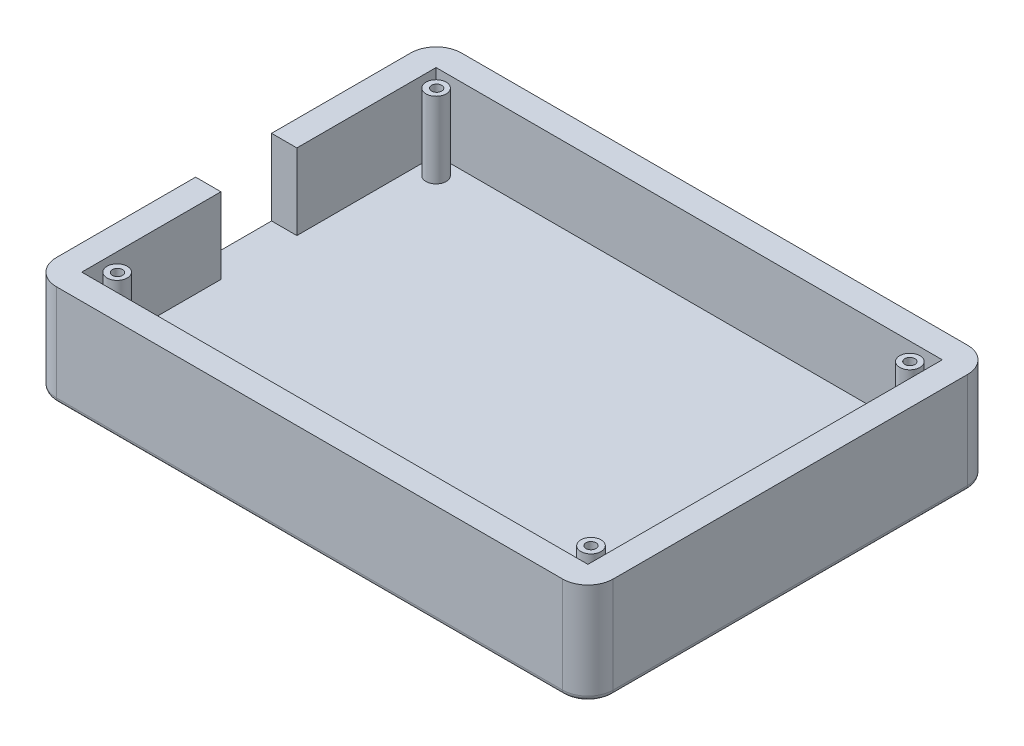
ISO-10303-21;
HEADER;
FILE_DESCRIPTION(('STEP AP214'),'2;1');
FILE_NAME('part.step','',(''),(''),'','','');
FILE_SCHEMA(('AUTOMOTIVE_DESIGN { 1 0 10303 214 1 1 1 1 }'));
ENDSEC;
DATA;
#1=APPLICATION_CONTEXT('core data for automotive mechanical design processes');
#2=APPLICATION_PROTOCOL_DEFINITION('international standard','automotive_design',2000,#1);
#3=PRODUCT_CONTEXT('',#1,'mechanical');
#4=PRODUCT('Part','Part','',(#3));
#5=PRODUCT_RELATED_PRODUCT_CATEGORY('part','',(#4));
#6=PRODUCT_DEFINITION_FORMATION('','',#4);
#7=PRODUCT_DEFINITION_CONTEXT('part definition',#1,'design');
#8=PRODUCT_DEFINITION('design','',#6,#7);
#9=PRODUCT_DEFINITION_SHAPE('','',#8);
#10=(LENGTH_UNIT() NAMED_UNIT(*) SI_UNIT(.MILLI.,.METRE.));
#11=(NAMED_UNIT(*) PLANE_ANGLE_UNIT() SI_UNIT($,.RADIAN.));
#12=(NAMED_UNIT(*) SI_UNIT($,.STERADIAN.) SOLID_ANGLE_UNIT());
#13=UNCERTAINTY_MEASURE_WITH_UNIT(LENGTH_MEASURE(1.E-05),#10,'distance_accuracy_value','');
#14=(GEOMETRIC_REPRESENTATION_CONTEXT(3) GLOBAL_UNCERTAINTY_ASSIGNED_CONTEXT((#13)) GLOBAL_UNIT_ASSIGNED_CONTEXT((#10,
#11,#12)) REPRESENTATION_CONTEXT('',''));
#15=CARTESIAN_POINT('',(0.,0.,0.));
#16=DIRECTION('',(0.,0.,1.));
#17=DIRECTION('',(1.,0.,0.));
#18=AXIS2_PLACEMENT_3D('',#15,#16,#17);
#19=CARTESIAN_POINT('',(-50.,20.,40.));
#20=DIRECTION('',(1.,0.,0.));
#21=DIRECTION('',(0.,0.,-1.));
#22=AXIS2_PLACEMENT_3D('',#19,#20,#21);
#23=PLANE('',#22);
#24=DIRECTION('',(0.,-1.,0.));
#25=VECTOR('',#24,1.);
#26=CARTESIAN_POINT('',(-50.,5.,-7.5));
#27=LINE('',#26,#25);
#28=CARTESIAN_POINT('',(-50.,20.,-7.5));
#29=VERTEX_POINT('',#28);
#30=CARTESIAN_POINT('',(-50.,5.,-7.5));
#31=VERTEX_POINT('',#30);
#32=EDGE_CURVE('E176',#29,#31,#27,.T.);
#33=ORIENTED_EDGE('',*,*,#32,.T.);
#34=DIRECTION('',(0.,0.,1.));
#35=VECTOR('',#34,1.);
#36=CARTESIAN_POINT('',(-50.,5.,0.));
#37=LINE('',#36,#35);
#38=CARTESIAN_POINT('',(-50.,5.,-35.));
#39=VERTEX_POINT('',#38);
#40=EDGE_CURVE('E455',#39,#31,#37,.T.);
#41=ORIENTED_EDGE('',*,*,#40,.F.);
#42=DIRECTION('',(0.,-1.,0.));
#43=VECTOR('',#42,1.);
#44=CARTESIAN_POINT('',(-50.,20.,-35.));
#45=LINE('',#44,#43);
#46=CARTESIAN_POINT('',(-50.,20.,-35.));
#47=VERTEX_POINT('',#46);
#48=EDGE_CURVE('E202',#47,#39,#45,.T.);
#49=ORIENTED_EDGE('',*,*,#48,.F.);
#50=DIRECTION('',(0.,0.,1.));
#51=VECTOR('',#50,1.);
#52=CARTESIAN_POINT('',(-50.,20.,0.));
#53=LINE('',#52,#51);
#54=EDGE_CURVE('E194',#47,#29,#53,.T.);
#55=ORIENTED_EDGE('',*,*,#54,.T.);
#56=EDGE_LOOP('',(#33,#41,#49,#55));
#57=FACE_BOUND('',#56,.T.);
#58=ADVANCED_FACE('F38',(#57),#23,.T.);
#59=CARTESIAN_POINT('',(0.,20.,0.));
#60=DIRECTION('',(0.,-1.,0.));
#61=DIRECTION('',(0.,0.,-1.));
#62=AXIS2_PLACEMENT_3D('',#59,#60,#61);
#63=PLANE('',#62);
#64=DIRECTION('',(0.,0.,1.));
#65=VECTOR('',#64,1.);
#66=CARTESIAN_POINT('',(-55.,20.,40.));
#67=LINE('',#66,#65);
#68=CARTESIAN_POINT('',(-55.,20.,-35.));
#69=VERTEX_POINT('',#68);
#70=CARTESIAN_POINT('',(-55.,20.,-7.5));
#71=VERTEX_POINT('',#70);
#72=EDGE_CURVE('E196',#69,#71,#67,.T.);
#73=ORIENTED_EDGE('',*,*,#72,.T.);
#74=DIRECTION('',(-1.,0.,0.));
#75=VECTOR('',#74,1.);
#76=CARTESIAN_POINT('',(-28.7867965644036,20.,-7.5));
#77=LINE('',#76,#75);
#78=EDGE_CURVE('E180',#29,#71,#77,.T.);
#79=ORIENTED_EDGE('',*,*,#78,.F.);
#80=ORIENTED_EDGE('',*,*,#54,.F.);
#81=DIRECTION('',(-1.,0.,0.));
#82=VECTOR('',#81,1.);
#83=CARTESIAN_POINT('',(0.,20.,-35.));
#84=LINE('',#83,#82);
#85=CARTESIAN_POINT('',(50.,20.,-35.));
#86=VERTEX_POINT('',#85);
#87=EDGE_CURVE('E211',#86,#47,#84,.T.);
#88=ORIENTED_EDGE('',*,*,#87,.F.);
#89=DIRECTION('',(0.,0.,-1.));
#90=VECTOR('',#89,1.);
#91=CARTESIAN_POINT('',(50.,20.,0.));
#92=LINE('',#91,#90);
#93=CARTESIAN_POINT('',(50.,20.,35.));
#94=VERTEX_POINT('',#93);
#95=EDGE_CURVE('E463',#94,#86,#92,.T.);
#96=ORIENTED_EDGE('',*,*,#95,.F.);
#97=DIRECTION('',(1.,0.,0.));
#98=VECTOR('',#97,1.);
#99=CARTESIAN_POINT('',(0.,20.,35.));
#100=LINE('',#99,#98);
#101=CARTESIAN_POINT('',(-50.,20.,35.));
#102=VERTEX_POINT('',#101);
#103=EDGE_CURVE('E204',#102,#94,#100,.T.);
#104=ORIENTED_EDGE('',*,*,#103,.F.);
#105=CARTESIAN_POINT('',(-50.,20.,7.5));
#106=VERTEX_POINT('',#105);
#107=EDGE_CURVE('E205',#106,#102,#53,.T.);
#108=ORIENTED_EDGE('',*,*,#107,.F.);
#109=DIRECTION('',(-1.,0.,0.));
#110=VECTOR('',#109,1.);
#111=CARTESIAN_POINT('',(-28.7867965644036,20.,7.5));
#112=LINE('',#111,#110);
#113=CARTESIAN_POINT('',(-55.,20.,7.5));
#114=VERTEX_POINT('',#113);
#115=EDGE_CURVE('E428',#106,#114,#112,.T.);
#116=ORIENTED_EDGE('',*,*,#115,.T.);
#117=CARTESIAN_POINT('',(-55.,20.,35.));
#118=VERTEX_POINT('',#117);
#119=EDGE_CURVE('E224',#114,#118,#67,.T.);
#120=ORIENTED_EDGE('',*,*,#119,.T.);
#121=CARTESIAN_POINT('',(-50.,20.,35.));
#122=DIRECTION('',(0.,-1.,0.));
#123=DIRECTION('',(0.,0.,-1.));
#124=AXIS2_PLACEMENT_3D('',#121,#122,#123);
#125=CIRCLE('',#124,5.);
#126=CARTESIAN_POINT('',(-50.,20.,40.));
#127=VERTEX_POINT('',#126);
#128=EDGE_CURVE('E244',#118,#127,#125,.F.);
#129=ORIENTED_EDGE('',*,*,#128,.T.);
#130=DIRECTION('',(1.,0.,0.));
#131=VECTOR('',#130,1.);
#132=CARTESIAN_POINT('',(-55.,20.,40.));
#133=LINE('',#132,#131);
#134=CARTESIAN_POINT('',(50.,20.,40.));
#135=VERTEX_POINT('',#134);
#136=EDGE_CURVE('E227',#127,#135,#133,.T.);
#137=ORIENTED_EDGE('',*,*,#136,.T.);
#138=CARTESIAN_POINT('',(50.,20.,35.));
#139=DIRECTION('',(0.,-1.,0.));
#140=DIRECTION('',(0.,0.,-1.));
#141=AXIS2_PLACEMENT_3D('',#138,#139,#140);
#142=CIRCLE('',#141,5.);
#143=CARTESIAN_POINT('',(55.,20.,35.));
#144=VERTEX_POINT('',#143);
#145=EDGE_CURVE('E247',#135,#144,#142,.F.);
#146=ORIENTED_EDGE('',*,*,#145,.T.);
#147=DIRECTION('',(0.,0.,-1.));
#148=VECTOR('',#147,1.);
#149=CARTESIAN_POINT('',(55.,20.,40.));
#150=LINE('',#149,#148);
#151=CARTESIAN_POINT('',(55.,20.,-35.));
#152=VERTEX_POINT('',#151);
#153=EDGE_CURVE('E215',#144,#152,#150,.T.);
#154=ORIENTED_EDGE('',*,*,#153,.T.);
#155=CARTESIAN_POINT('',(50.,20.,-35.));
#156=DIRECTION('',(0.,-1.,0.));
#157=DIRECTION('',(0.,0.,-1.));
#158=AXIS2_PLACEMENT_3D('',#155,#156,#157);
#159=CIRCLE('',#158,5.);
#160=CARTESIAN_POINT('',(50.,20.,-40.));
#161=VERTEX_POINT('',#160);
#162=EDGE_CURVE('E250',#152,#161,#159,.F.);
#163=ORIENTED_EDGE('',*,*,#162,.T.);
#164=DIRECTION('',(-1.,0.,0.));
#165=VECTOR('',#164,1.);
#166=CARTESIAN_POINT('',(-55.,20.,-40.));
#167=LINE('',#166,#165);
#168=CARTESIAN_POINT('',(-50.,20.,-40.));
#169=VERTEX_POINT('',#168);
#170=EDGE_CURVE('E219',#161,#169,#167,.T.);
#171=ORIENTED_EDGE('',*,*,#170,.T.);
#172=CARTESIAN_POINT('',(-50.,20.,-35.));
#173=DIRECTION('',(0.,-1.,0.));
#174=DIRECTION('',(0.,0.,-1.));
#175=AXIS2_PLACEMENT_3D('',#172,#173,#174);
#176=CIRCLE('',#175,5.);
#177=EDGE_CURVE('E253',#169,#69,#176,.F.);
#178=ORIENTED_EDGE('',*,*,#177,.T.);
#179=EDGE_LOOP('',(#73,#79,#80,#88,#96,#104,#108,#116,#120,#129,#137,#146,#154,#163,#171,#178));
#180=FACE_BOUND('',#179,.T.);
#181=ADVANCED_FACE('F192',(#180),#63,.F.);
#182=CARTESIAN_POINT('',(55.,20.,40.));
#183=DIRECTION('',(-1.,0.,0.));
#184=DIRECTION('',(0.,0.,1.));
#185=AXIS2_PLACEMENT_3D('',#182,#183,#184);
#186=PLANE('',#185);
#187=DIRECTION('',(0.,-1.,0.));
#188=VECTOR('',#187,1.);
#189=CARTESIAN_POINT('',(55.,20.,35.));
#190=LINE('',#189,#188);
#191=CARTESIAN_POINT('',(55.,1.,35.));
#192=VERTEX_POINT('',#191);
#193=EDGE_CURVE('E256',#144,#192,#190,.T.);
#194=ORIENTED_EDGE('',*,*,#193,.T.);
#195=DIRECTION('',(0.,0.,-1.));
#196=VECTOR('',#195,1.);
#197=CARTESIAN_POINT('',(55.,1.,-35.));
#198=LINE('',#197,#196);
#199=CARTESIAN_POINT('',(55.,1.,-35.));
#200=VERTEX_POINT('',#199);
#201=EDGE_CURVE('E11',#192,#200,#198,.T.);
#202=ORIENTED_EDGE('',*,*,#201,.T.);
#203=DIRECTION('',(0.,-1.,0.));
#204=VECTOR('',#203,1.);
#205=CARTESIAN_POINT('',(55.,20.,-35.));
#206=LINE('',#205,#204);
#207=EDGE_CURVE('E259',#200,#152,#206,.F.);
#208=ORIENTED_EDGE('',*,*,#207,.T.);
#209=ORIENTED_EDGE('',*,*,#153,.F.);
#210=EDGE_LOOP('',(#194,#202,#208,#209));
#211=FACE_BOUND('',#210,.T.);
#212=ADVANCED_FACE('F563',(#211),#186,.F.);
#213=CARTESIAN_POINT('',(-55.,20.,-40.));
#214=DIRECTION('',(0.,0.,1.));
#215=DIRECTION('',(1.,0.,0.));
#216=AXIS2_PLACEMENT_3D('',#213,#214,#215);
#217=PLANE('',#216);
#218=DIRECTION('',(0.,-1.,0.));
#219=VECTOR('',#218,1.);
#220=CARTESIAN_POINT('',(50.,20.,-40.));
#221=LINE('',#220,#219);
#222=CARTESIAN_POINT('',(50.,1.,-40.));
#223=VERTEX_POINT('',#222);
#224=EDGE_CURVE('E238',#161,#223,#221,.T.);
#225=ORIENTED_EDGE('',*,*,#224,.T.);
#226=DIRECTION('',(-1.,0.,0.));
#227=VECTOR('',#226,1.);
#228=CARTESIAN_POINT('',(-50.,1.,-40.));
#229=LINE('',#228,#227);
#230=CARTESIAN_POINT('',(-50.,1.,-40.));
#231=VERTEX_POINT('',#230);
#232=EDGE_CURVE('E326',#223,#231,#229,.T.);
#233=ORIENTED_EDGE('',*,*,#232,.T.);
#234=DIRECTION('',(0.,-1.,0.));
#235=VECTOR('',#234,1.);
#236=CARTESIAN_POINT('',(-50.,20.,-40.));
#237=LINE('',#236,#235);
#238=EDGE_CURVE('E241',#231,#169,#237,.F.);
#239=ORIENTED_EDGE('',*,*,#238,.T.);
#240=ORIENTED_EDGE('',*,*,#170,.F.);
#241=EDGE_LOOP('',(#225,#233,#239,#240));
#242=FACE_BOUND('',#241,.T.);
#243=ADVANCED_FACE('F537',(#242),#217,.F.);
#244=CARTESIAN_POINT('',(-55.,20.,40.));
#245=DIRECTION('',(1.,0.,0.));
#246=DIRECTION('',(0.,0.,-1.));
#247=AXIS2_PLACEMENT_3D('',#244,#245,#246);
#248=PLANE('',#247);
#249=DIRECTION('',(0.,-1.,0.));
#250=VECTOR('',#249,1.);
#251=CARTESIAN_POINT('',(-55.,20.,-35.));
#252=LINE('',#251,#250);
#253=CARTESIAN_POINT('',(-55.,1.,-35.));
#254=VERTEX_POINT('',#253);
#255=EDGE_CURVE('E234',#69,#254,#252,.T.);
#256=ORIENTED_EDGE('',*,*,#255,.T.);
#257=DIRECTION('',(0.,0.,1.));
#258=VECTOR('',#257,1.);
#259=CARTESIAN_POINT('',(-55.,1.,35.));
#260=LINE('',#259,#258);
#261=CARTESIAN_POINT('',(-55.,1.,35.));
#262=VERTEX_POINT('',#261);
#263=EDGE_CURVE('E320',#254,#262,#260,.T.);
#264=ORIENTED_EDGE('',*,*,#263,.T.);
#265=DIRECTION('',(0.,-1.,0.));
#266=VECTOR('',#265,1.);
#267=CARTESIAN_POINT('',(-55.,20.,35.));
#268=LINE('',#267,#266);
#269=EDGE_CURVE('E231',#262,#118,#268,.F.);
#270=ORIENTED_EDGE('',*,*,#269,.T.);
#271=ORIENTED_EDGE('',*,*,#119,.F.);
#272=DIRECTION('',(0.,1.,0.));
#273=VECTOR('',#272,1.);
#274=CARTESIAN_POINT('',(-55.,5.,7.5));
#275=LINE('',#274,#273);
#276=CARTESIAN_POINT('',(-55.,5.,7.5));
#277=VERTEX_POINT('',#276);
#278=EDGE_CURVE('E416',#277,#114,#275,.T.);
#279=ORIENTED_EDGE('',*,*,#278,.F.);
#280=DIRECTION('',(0.,0.,1.));
#281=VECTOR('',#280,1.);
#282=CARTESIAN_POINT('',(-55.,5.,-7.5));
#283=LINE('',#282,#281);
#284=CARTESIAN_POINT('',(-55.,5.,-7.5));
#285=VERTEX_POINT('',#284);
#286=EDGE_CURVE('E198',#285,#277,#283,.T.);
#287=ORIENTED_EDGE('',*,*,#286,.F.);
#288=DIRECTION('',(0.,-1.,0.));
#289=VECTOR('',#288,1.);
#290=CARTESIAN_POINT('',(-55.,5.,-7.5));
#291=LINE('',#290,#289);
#292=EDGE_CURVE('E420',#71,#285,#291,.T.);
#293=ORIENTED_EDGE('',*,*,#292,.F.);
#294=ORIENTED_EDGE('',*,*,#72,.F.);
#295=EDGE_LOOP('',(#256,#264,#270,#271,#279,#287,#293,#294));
#296=FACE_BOUND('',#295,.T.);
#297=ADVANCED_FACE('F494',(#296),#248,.F.);
#298=CARTESIAN_POINT('',(-55.,20.,40.));
#299=DIRECTION('',(0.,0.,-1.));
#300=DIRECTION('',(-1.,0.,0.));
#301=AXIS2_PLACEMENT_3D('',#298,#299,#300);
#302=PLANE('',#301);
#303=DIRECTION('',(0.,-1.,0.));
#304=VECTOR('',#303,1.);
#305=CARTESIAN_POINT('',(-50.,20.,40.));
#306=LINE('',#305,#304);
#307=CARTESIAN_POINT('',(-50.,1.,40.));
#308=VERTEX_POINT('',#307);
#309=EDGE_CURVE('E262',#127,#308,#306,.T.);
#310=ORIENTED_EDGE('',*,*,#309,.T.);
#311=DIRECTION('',(1.,0.,0.));
#312=VECTOR('',#311,1.);
#313=CARTESIAN_POINT('',(50.,1.,40.));
#314=LINE('',#313,#312);
#315=CARTESIAN_POINT('',(50.,1.,40.));
#316=VERTEX_POINT('',#315);
#317=EDGE_CURVE('E314',#308,#316,#314,.T.);
#318=ORIENTED_EDGE('',*,*,#317,.T.);
#319=DIRECTION('',(0.,-1.,0.));
#320=VECTOR('',#319,1.);
#321=CARTESIAN_POINT('',(50.,20.,40.));
#322=LINE('',#321,#320);
#323=EDGE_CURVE('E266',#316,#135,#322,.F.);
#324=ORIENTED_EDGE('',*,*,#323,.T.);
#325=ORIENTED_EDGE('',*,*,#136,.F.);
#326=EDGE_LOOP('',(#310,#318,#324,#325));
#327=FACE_BOUND('',#326,.T.);
#328=ADVANCED_FACE('F515',(#327),#302,.F.);
#329=CARTESIAN_POINT('',(0.,0.,0.));
#330=DIRECTION('',(0.,-1.,0.));
#331=DIRECTION('',(0.,0.,-1.));
#332=AXIS2_PLACEMENT_3D('',#329,#330,#331);
#333=PLANE('',#332);
#334=DIRECTION('',(0.,0.,-1.));
#335=VECTOR('',#334,1.);
#336=CARTESIAN_POINT('',(54.,0.,35.));
#337=LINE('',#336,#335);
#338=CARTESIAN_POINT('',(54.,0.,-35.));
#339=VERTEX_POINT('',#338);
#340=CARTESIAN_POINT('',(54.,0.,35.));
#341=VERTEX_POINT('',#340);
#342=EDGE_CURVE('E285',#339,#341,#337,.F.);
#343=ORIENTED_EDGE('',*,*,#342,.T.);
#344=CARTESIAN_POINT('',(50.,0.,35.));
#345=DIRECTION('',(0.,-1.,0.));
#346=DIRECTION('',(0.,0.,-1.));
#347=AXIS2_PLACEMENT_3D('',#344,#345,#346);
#348=CIRCLE('',#347,4.);
#349=CARTESIAN_POINT('',(50.,0.,39.));
#350=VERTEX_POINT('',#349);
#351=EDGE_CURVE('E306',#341,#350,#348,.T.);
#352=ORIENTED_EDGE('',*,*,#351,.T.);
#353=DIRECTION('',(1.,0.,0.));
#354=VECTOR('',#353,1.);
#355=CARTESIAN_POINT('',(-50.,0.,39.));
#356=LINE('',#355,#354);
#357=CARTESIAN_POINT('',(-50.,0.,39.));
#358=VERTEX_POINT('',#357);
#359=EDGE_CURVE('E303',#350,#358,#356,.F.);
#360=ORIENTED_EDGE('',*,*,#359,.T.);
#361=CARTESIAN_POINT('',(-50.,0.,35.));
#362=DIRECTION('',(0.,-1.,0.));
#363=DIRECTION('',(0.,0.,-1.));
#364=AXIS2_PLACEMENT_3D('',#361,#362,#363);
#365=CIRCLE('',#364,4.);
#366=CARTESIAN_POINT('',(-54.,0.,35.));
#367=VERTEX_POINT('',#366);
#368=EDGE_CURVE('E300',#358,#367,#365,.T.);
#369=ORIENTED_EDGE('',*,*,#368,.T.);
#370=DIRECTION('',(0.,0.,1.));
#371=VECTOR('',#370,1.);
#372=CARTESIAN_POINT('',(-54.,0.,-35.));
#373=LINE('',#372,#371);
#374=CARTESIAN_POINT('',(-54.,0.,-35.));
#375=VERTEX_POINT('',#374);
#376=EDGE_CURVE('E297',#367,#375,#373,.F.);
#377=ORIENTED_EDGE('',*,*,#376,.T.);
#378=CARTESIAN_POINT('',(-50.,0.,-35.));
#379=DIRECTION('',(0.,-1.,0.));
#380=DIRECTION('',(0.,0.,-1.));
#381=AXIS2_PLACEMENT_3D('',#378,#379,#380);
#382=CIRCLE('',#381,4.);
#383=CARTESIAN_POINT('',(-50.,0.,-39.));
#384=VERTEX_POINT('',#383);
#385=EDGE_CURVE('E294',#375,#384,#382,.T.);
#386=ORIENTED_EDGE('',*,*,#385,.T.);
#387=DIRECTION('',(-1.,0.,0.));
#388=VECTOR('',#387,1.);
#389=CARTESIAN_POINT('',(50.,0.,-39.));
#390=LINE('',#389,#388);
#391=CARTESIAN_POINT('',(50.,0.,-39.));
#392=VERTEX_POINT('',#391);
#393=EDGE_CURVE('E291',#384,#392,#390,.F.);
#394=ORIENTED_EDGE('',*,*,#393,.T.);
#395=CARTESIAN_POINT('',(50.,0.,-35.));
#396=DIRECTION('',(0.,-1.,0.));
#397=DIRECTION('',(0.,0.,-1.));
#398=AXIS2_PLACEMENT_3D('',#395,#396,#397);
#399=CIRCLE('',#398,4.);
#400=EDGE_CURVE('E288',#392,#339,#399,.T.);
#401=ORIENTED_EDGE('',*,*,#400,.T.);
#402=EDGE_LOOP('',(#343,#352,#360,#369,#377,#386,#394,#401));
#403=FACE_BOUND('',#402,.T.);
#404=ADVANCED_FACE('F547',(#403),#333,.T.);
#405=CARTESIAN_POINT('',(50.,20.,40.));
#406=DIRECTION('',(-1.,0.,0.));
#407=DIRECTION('',(0.,0.,1.));
#408=AXIS2_PLACEMENT_3D('',#405,#406,#407);
#409=PLANE('',#408);
#410=DIRECTION('',(0.,0.,-1.));
#411=VECTOR('',#410,1.);
#412=CARTESIAN_POINT('',(50.,5.,0.));
#413=LINE('',#412,#411);
#414=CARTESIAN_POINT('',(50.,5.,35.));
#415=VERTEX_POINT('',#414);
#416=CARTESIAN_POINT('',(50.,5.,-35.));
#417=VERTEX_POINT('',#416);
#418=EDGE_CURVE('E438',#415,#417,#413,.T.);
#419=ORIENTED_EDGE('',*,*,#418,.F.);
#420=DIRECTION('',(0.,-1.,0.));
#421=VECTOR('',#420,1.);
#422=CARTESIAN_POINT('',(50.,20.,35.));
#423=LINE('',#422,#421);
#424=EDGE_CURVE('E209',#94,#415,#423,.T.);
#425=ORIENTED_EDGE('',*,*,#424,.F.);
#426=ORIENTED_EDGE('',*,*,#95,.T.);
#427=DIRECTION('',(0.,-1.,0.));
#428=VECTOR('',#427,1.);
#429=CARTESIAN_POINT('',(50.,20.,-35.));
#430=LINE('',#429,#428);
#431=EDGE_CURVE('E220',#86,#417,#430,.T.);
#432=ORIENTED_EDGE('',*,*,#431,.T.);
#433=EDGE_LOOP('',(#419,#425,#426,#432));
#434=FACE_BOUND('',#433,.T.);
#435=ADVANCED_FACE('F479',(#434),#409,.T.);
#436=CARTESIAN_POINT('',(-55.,20.,-35.));
#437=DIRECTION('',(0.,0.,1.));
#438=DIRECTION('',(1.,0.,0.));
#439=AXIS2_PLACEMENT_3D('',#436,#437,#438);
#440=PLANE('',#439);
#441=DIRECTION('',(-1.,0.,0.));
#442=VECTOR('',#441,1.);
#443=CARTESIAN_POINT('',(0.,5.,-35.));
#444=LINE('',#443,#442);
#445=EDGE_CURVE('E442',#417,#39,#444,.T.);
#446=ORIENTED_EDGE('',*,*,#445,.F.);
#447=ORIENTED_EDGE('',*,*,#431,.F.);
#448=ORIENTED_EDGE('',*,*,#87,.T.);
#449=ORIENTED_EDGE('',*,*,#48,.T.);
#450=EDGE_LOOP('',(#446,#447,#448,#449));
#451=FACE_BOUND('',#450,.T.);
#452=ADVANCED_FACE('F471',(#451),#440,.T.);
#453=DIRECTION('',(0.,1.,0.));
#454=VECTOR('',#453,1.);
#455=CARTESIAN_POINT('',(-50.,5.,7.5));
#456=LINE('',#455,#454);
#457=CARTESIAN_POINT('',(-50.,5.,7.5));
#458=VERTEX_POINT('',#457);
#459=EDGE_CURVE('E425',#458,#106,#456,.T.);
#460=ORIENTED_EDGE('',*,*,#459,.T.);
#461=ORIENTED_EDGE('',*,*,#107,.T.);
#462=DIRECTION('',(0.,-1.,0.));
#463=VECTOR('',#462,1.);
#464=CARTESIAN_POINT('',(-50.,20.,35.));
#465=LINE('',#464,#463);
#466=CARTESIAN_POINT('',(-50.,5.,35.));
#467=VERTEX_POINT('',#466);
#468=EDGE_CURVE('E449',#102,#467,#465,.T.);
#469=ORIENTED_EDGE('',*,*,#468,.T.);
#470=EDGE_CURVE('E452',#458,#467,#37,.T.);
#471=ORIENTED_EDGE('',*,*,#470,.F.);
#472=EDGE_LOOP('',(#460,#461,#469,#471));
#473=FACE_BOUND('',#472,.T.);
#474=ADVANCED_FACE('F486',(#473),#23,.T.);
#475=CARTESIAN_POINT('',(-55.,20.,35.));
#476=DIRECTION('',(0.,0.,-1.));
#477=DIRECTION('',(-1.,0.,0.));
#478=AXIS2_PLACEMENT_3D('',#475,#476,#477);
#479=PLANE('',#478);
#480=DIRECTION('',(1.,0.,0.));
#481=VECTOR('',#480,1.);
#482=CARTESIAN_POINT('',(0.,5.,35.));
#483=LINE('',#482,#481);
#484=EDGE_CURVE('E458',#467,#415,#483,.T.);
#485=ORIENTED_EDGE('',*,*,#484,.F.);
#486=ORIENTED_EDGE('',*,*,#468,.F.);
#487=ORIENTED_EDGE('',*,*,#103,.T.);
#488=ORIENTED_EDGE('',*,*,#424,.T.);
#489=EDGE_LOOP('',(#485,#486,#487,#488));
#490=FACE_BOUND('',#489,.T.);
#491=ADVANCED_FACE('F477',(#490),#479,.T.);
#492=CARTESIAN_POINT('',(0.,5.,0.));
#493=DIRECTION('',(0.,-1.,0.));
#494=DIRECTION('',(0.,0.,-1.));
#495=AXIS2_PLACEMENT_3D('',#492,#493,#494);
#496=PLANE('',#495);
#497=CARTESIAN_POINT('',(-46.5,5.,31.5));
#498=DIRECTION('',(0.,-1.,0.));
#499=DIRECTION('',(0.,0.,-1.));
#500=AXIS2_PLACEMENT_3D('',#497,#498,#499);
#501=CIRCLE('',#500,2.);
#502=CARTESIAN_POINT('',(-46.5,5.,29.5));
#503=VERTEX_POINT('',#502);
#504=EDGE_CURVE('E281',#503,#503,#501,.F.);
#505=ORIENTED_EDGE('',*,*,#504,.F.);
#506=EDGE_LOOP('',(#505));
#507=FACE_BOUND('',#506,.T.);
#508=CARTESIAN_POINT('',(-46.5,5.,-31.5));
#509=DIRECTION('',(0.,-1.,0.));
#510=DIRECTION('',(0.,0.,-1.));
#511=AXIS2_PLACEMENT_3D('',#508,#509,#510);
#512=CIRCLE('',#511,2.);
#513=CARTESIAN_POINT('',(-46.5,5.,-33.5));
#514=VERTEX_POINT('',#513);
#515=EDGE_CURVE('E277',#514,#514,#512,.F.);
#516=ORIENTED_EDGE('',*,*,#515,.F.);
#517=EDGE_LOOP('',(#516));
#518=FACE_BOUND('',#517,.T.);
#519=CARTESIAN_POINT('',(47.1,5.,31.5));
#520=DIRECTION('',(0.,-1.,0.));
#521=DIRECTION('',(0.,0.,-1.));
#522=AXIS2_PLACEMENT_3D('',#519,#520,#521);
#523=CIRCLE('',#522,2.);
#524=CARTESIAN_POINT('',(47.1,5.,29.5));
#525=VERTEX_POINT('',#524);
#526=EDGE_CURVE('E273',#525,#525,#523,.F.);
#527=ORIENTED_EDGE('',*,*,#526,.F.);
#528=EDGE_LOOP('',(#527));
#529=FACE_BOUND('',#528,.T.);
#530=CARTESIAN_POINT('',(47.1,5.,-31.5));
#531=DIRECTION('',(0.,-1.,0.));
#532=DIRECTION('',(0.,0.,-1.));
#533=AXIS2_PLACEMENT_3D('',#530,#531,#532);
#534=CIRCLE('',#533,2.);
#535=CARTESIAN_POINT('',(47.1,5.,-33.5));
#536=VERTEX_POINT('',#535);
#537=EDGE_CURVE('E269',#536,#536,#534,.F.);
#538=ORIENTED_EDGE('',*,*,#537,.F.);
#539=EDGE_LOOP('',(#538));
#540=FACE_BOUND('',#539,.T.);
#541=ORIENTED_EDGE('',*,*,#418,.T.);
#542=ORIENTED_EDGE('',*,*,#445,.T.);
#543=ORIENTED_EDGE('',*,*,#40,.T.);
#544=DIRECTION('',(-1.,0.,0.));
#545=VECTOR('',#544,1.);
#546=CARTESIAN_POINT('',(-28.7867965644036,5.,-7.5));
#547=LINE('',#546,#545);
#548=EDGE_CURVE('E182',#31,#285,#547,.T.);
#549=ORIENTED_EDGE('',*,*,#548,.T.);
#550=ORIENTED_EDGE('',*,*,#286,.T.);
#551=DIRECTION('',(-1.,0.,0.));
#552=VECTOR('',#551,1.);
#553=CARTESIAN_POINT('',(-28.7867965644036,5.,7.5));
#554=LINE('',#553,#552);
#555=EDGE_CURVE('E429',#458,#277,#554,.T.);
#556=ORIENTED_EDGE('',*,*,#555,.F.);
#557=ORIENTED_EDGE('',*,*,#470,.T.);
#558=ORIENTED_EDGE('',*,*,#484,.T.);
#559=EDGE_LOOP('',(#541,#542,#543,#549,#550,#556,#557,#558));
#560=FACE_BOUND('',#559,.T.);
#561=ADVANCED_FACE('F481',(#507,#518,#529,#540,#560),#496,.F.);
#562=CARTESIAN_POINT('',(-50.,20.,-35.));
#563=DIRECTION('',(0.,-1.,0.));
#564=DIRECTION('',(0.,0.,-1.));
#565=AXIS2_PLACEMENT_3D('',#562,#563,#564);
#566=CYLINDRICAL_SURFACE('',#565,5.);
#567=ORIENTED_EDGE('',*,*,#238,.F.);
#568=CARTESIAN_POINT('',(-50.,1.,-35.));
#569=DIRECTION('',(0.,-1.,0.));
#570=DIRECTION('',(0.,0.,-1.));
#571=AXIS2_PLACEMENT_3D('',#568,#569,#570);
#572=CIRCLE('',#571,5.);
#573=EDGE_CURVE('E323',#231,#254,#572,.F.);
#574=ORIENTED_EDGE('',*,*,#573,.T.);
#575=ORIENTED_EDGE('',*,*,#255,.F.);
#576=ORIENTED_EDGE('',*,*,#177,.F.);
#577=EDGE_LOOP('',(#567,#574,#575,#576));
#578=FACE_BOUND('',#577,.T.);
#579=ADVANCED_FACE('F542',(#578),#566,.T.);
#580=CARTESIAN_POINT('',(50.,20.,-35.));
#581=DIRECTION('',(0.,-1.,0.));
#582=DIRECTION('',(0.,0.,-1.));
#583=AXIS2_PLACEMENT_3D('',#580,#581,#582);
#584=CYLINDRICAL_SURFACE('',#583,5.);
#585=ORIENTED_EDGE('',*,*,#207,.F.);
#586=CARTESIAN_POINT('',(50.,1.,-35.));
#587=DIRECTION('',(0.,-1.,0.));
#588=DIRECTION('',(0.,0.,-1.));
#589=AXIS2_PLACEMENT_3D('',#586,#587,#588);
#590=CIRCLE('',#589,5.);
#591=EDGE_CURVE('E48',#200,#223,#590,.F.);
#592=ORIENTED_EDGE('',*,*,#591,.T.);
#593=ORIENTED_EDGE('',*,*,#224,.F.);
#594=ORIENTED_EDGE('',*,*,#162,.F.);
#595=EDGE_LOOP('',(#585,#592,#593,#594));
#596=FACE_BOUND('',#595,.T.);
#597=ADVANCED_FACE('F651',(#596),#584,.T.);
#598=CARTESIAN_POINT('',(50.,20.,35.));
#599=DIRECTION('',(0.,-1.,0.));
#600=DIRECTION('',(0.,0.,-1.));
#601=AXIS2_PLACEMENT_3D('',#598,#599,#600);
#602=CYLINDRICAL_SURFACE('',#601,5.);
#603=ORIENTED_EDGE('',*,*,#323,.F.);
#604=CARTESIAN_POINT('',(50.,1.,35.));
#605=DIRECTION('',(0.,-1.,0.));
#606=DIRECTION('',(0.,0.,-1.));
#607=AXIS2_PLACEMENT_3D('',#604,#605,#606);
#608=CIRCLE('',#607,5.);
#609=EDGE_CURVE('E310',#316,#192,#608,.F.);
#610=ORIENTED_EDGE('',*,*,#609,.T.);
#611=ORIENTED_EDGE('',*,*,#193,.F.);
#612=ORIENTED_EDGE('',*,*,#145,.F.);
#613=EDGE_LOOP('',(#603,#610,#611,#612));
#614=FACE_BOUND('',#613,.T.);
#615=ADVANCED_FACE('F520',(#614),#602,.T.);
#616=CARTESIAN_POINT('',(-50.,20.,35.));
#617=DIRECTION('',(0.,-1.,0.));
#618=DIRECTION('',(0.,0.,-1.));
#619=AXIS2_PLACEMENT_3D('',#616,#617,#618);
#620=CYLINDRICAL_SURFACE('',#619,5.);
#621=ORIENTED_EDGE('',*,*,#269,.F.);
#622=CARTESIAN_POINT('',(-50.,1.,35.));
#623=DIRECTION('',(0.,-1.,0.));
#624=DIRECTION('',(0.,0.,-1.));
#625=AXIS2_PLACEMENT_3D('',#622,#623,#624);
#626=CIRCLE('',#625,5.);
#627=EDGE_CURVE('E317',#262,#308,#626,.F.);
#628=ORIENTED_EDGE('',*,*,#627,.T.);
#629=ORIENTED_EDGE('',*,*,#309,.F.);
#630=ORIENTED_EDGE('',*,*,#128,.F.);
#631=EDGE_LOOP('',(#621,#628,#629,#630));
#632=FACE_BOUND('',#631,.T.);
#633=ADVANCED_FACE('F500',(#632),#620,.T.);
#634=CARTESIAN_POINT('',(-28.7867965644036,5.,-7.5));
#635=DIRECTION('',(0.,0.,-1.));
#636=DIRECTION('',(-1.,0.,0.));
#637=AXIS2_PLACEMENT_3D('',#634,#635,#636);
#638=PLANE('',#637);
#639=ORIENTED_EDGE('',*,*,#78,.T.);
#640=ORIENTED_EDGE('',*,*,#292,.T.);
#641=ORIENTED_EDGE('',*,*,#548,.F.);
#642=ORIENTED_EDGE('',*,*,#32,.F.);
#643=EDGE_LOOP('',(#639,#640,#641,#642));
#644=FACE_BOUND('',#643,.T.);
#645=ADVANCED_FACE('F178',(#644),#638,.F.);
#646=CARTESIAN_POINT('',(-28.7867965644036,5.,7.5));
#647=DIRECTION('',(0.,0.,1.));
#648=DIRECTION('',(1.,0.,0.));
#649=AXIS2_PLACEMENT_3D('',#646,#647,#648);
#650=PLANE('',#649);
#651=ORIENTED_EDGE('',*,*,#555,.T.);
#652=ORIENTED_EDGE('',*,*,#278,.T.);
#653=ORIENTED_EDGE('',*,*,#115,.F.);
#654=ORIENTED_EDGE('',*,*,#459,.F.);
#655=EDGE_LOOP('',(#651,#652,#653,#654));
#656=FACE_BOUND('',#655,.T.);
#657=ADVANCED_FACE('F488',(#656),#650,.F.);
#658=CARTESIAN_POINT('',(47.1,25.6568542494924,-31.5));
#659=DIRECTION('',(0.,-1.,0.));
#660=DIRECTION('',(0.,0.,-1.));
#661=AXIS2_PLACEMENT_3D('',#658,#659,#660);
#662=CYLINDRICAL_SURFACE('',#661,2.);
#663=CARTESIAN_POINT('',(47.1,20.,-31.5));
#664=DIRECTION('',(0.,-1.,0.));
#665=DIRECTION('',(0.,0.,-1.));
#666=AXIS2_PLACEMENT_3D('',#663,#664,#665);
#667=CIRCLE('',#666,2.);
#668=CARTESIAN_POINT('',(47.1,20.,-33.5));
#669=VERTEX_POINT('',#668);
#670=EDGE_CURVE('E408',#669,#669,#667,.T.);
#671=ORIENTED_EDGE('',*,*,#670,.T.);
#672=EDGE_LOOP('',(#671));
#673=FACE_BOUND('',#672,.T.);
#674=ORIENTED_EDGE('',*,*,#537,.T.);
#675=EDGE_LOOP('',(#674));
#676=FACE_BOUND('',#675,.T.);
#677=ADVANCED_FACE('F578',(#673,#676),#662,.T.);
#678=CARTESIAN_POINT('',(47.1,25.6568542494924,-31.5));
#679=DIRECTION('',(0.,-1.,0.));
#680=DIRECTION('',(0.,0.,-1.));
#681=AXIS2_PLACEMENT_3D('',#678,#679,#680);
#682=CYLINDRICAL_SURFACE('',#681,0.999999999999998);
#683=CARTESIAN_POINT('',(47.1,20.,-31.5));
#684=DIRECTION('',(0.,-1.,0.));
#685=DIRECTION('',(0.,0.,-1.));
#686=AXIS2_PLACEMENT_3D('',#683,#684,#685);
#687=CIRCLE('',#686,0.999999999999998);
#688=CARTESIAN_POINT('',(47.1,20.,-32.5));
#689=VERTEX_POINT('',#688);
#690=EDGE_CURVE('E412',#689,#689,#687,.T.);
#691=ORIENTED_EDGE('',*,*,#690,.F.);
#692=EDGE_LOOP('',(#691));
#693=FACE_BOUND('',#692,.T.);
#694=CARTESIAN_POINT('',(47.1,5.,-31.5));
#695=DIRECTION('',(0.,1.,0.));
#696=DIRECTION('',(0.,0.,1.));
#697=AXIS2_PLACEMENT_3D('',#694,#695,#696);
#698=CIRCLE('',#697,0.999999999999998);
#699=CARTESIAN_POINT('',(47.1,5.,-30.5));
#700=VERTEX_POINT('',#699);
#701=EDGE_CURVE('E404',#700,#700,#698,.T.);
#702=ORIENTED_EDGE('',*,*,#701,.F.);
#703=EDGE_LOOP('',(#702));
#704=FACE_BOUND('',#703,.T.);
#705=ADVANCED_FACE('F583',(#693,#704),#682,.F.);
#706=CARTESIAN_POINT('',(0.,20.,0.));
#707=DIRECTION('',(0.,-1.,0.));
#708=DIRECTION('',(0.,0.,-1.));
#709=AXIS2_PLACEMENT_3D('',#706,#707,#708);
#710=PLANE('',#709);
#711=ORIENTED_EDGE('',*,*,#690,.T.);
#712=EDGE_LOOP('',(#711));
#713=FACE_BOUND('',#712,.T.);
#714=ORIENTED_EDGE('',*,*,#670,.F.);
#715=EDGE_LOOP('',(#714));
#716=FACE_BOUND('',#715,.T.);
#717=ADVANCED_FACE('F579',(#713,#716),#710,.F.);
#718=ORIENTED_EDGE('',*,*,#701,.T.);
#719=EDGE_LOOP('',(#718));
#720=FACE_BOUND('',#719,.T.);
#721=ADVANCED_FACE('F582',(#720),#496,.F.);
#722=CARTESIAN_POINT('',(47.1,25.6568542494924,31.5));
#723=DIRECTION('',(0.,-1.,0.));
#724=DIRECTION('',(0.,0.,-1.));
#725=AXIS2_PLACEMENT_3D('',#722,#723,#724);
#726=CYLINDRICAL_SURFACE('',#725,2.);
#727=CARTESIAN_POINT('',(47.1,20.,31.5));
#728=DIRECTION('',(0.,-1.,0.));
#729=DIRECTION('',(0.,0.,-1.));
#730=AXIS2_PLACEMENT_3D('',#727,#728,#729);
#731=CIRCLE('',#730,2.);
#732=CARTESIAN_POINT('',(47.1,20.,29.5));
#733=VERTEX_POINT('',#732);
#734=EDGE_CURVE('E396',#733,#733,#731,.T.);
#735=ORIENTED_EDGE('',*,*,#734,.T.);
#736=EDGE_LOOP('',(#735));
#737=FACE_BOUND('',#736,.T.);
#738=ORIENTED_EDGE('',*,*,#526,.T.);
#739=EDGE_LOOP('',(#738));
#740=FACE_BOUND('',#739,.T.);
#741=ADVANCED_FACE('F599',(#737,#740),#726,.T.);
#742=CARTESIAN_POINT('',(47.1,25.6568542494924,31.5));
#743=DIRECTION('',(0.,-1.,0.));
#744=DIRECTION('',(0.,0.,-1.));
#745=AXIS2_PLACEMENT_3D('',#742,#743,#744);
#746=CYLINDRICAL_SURFACE('',#745,1.);
#747=CARTESIAN_POINT('',(47.1,20.,31.5));
#748=DIRECTION('',(0.,-1.,0.));
#749=DIRECTION('',(0.,0.,-1.));
#750=AXIS2_PLACEMENT_3D('',#747,#748,#749);
#751=CIRCLE('',#750,1.);
#752=CARTESIAN_POINT('',(47.1,20.,30.5));
#753=VERTEX_POINT('',#752);
#754=EDGE_CURVE('E400',#753,#753,#751,.T.);
#755=ORIENTED_EDGE('',*,*,#754,.F.);
#756=EDGE_LOOP('',(#755));
#757=FACE_BOUND('',#756,.T.);
#758=CARTESIAN_POINT('',(47.1,5.,31.5));
#759=DIRECTION('',(0.,1.,0.));
#760=DIRECTION('',(0.,0.,-1.));
#761=AXIS2_PLACEMENT_3D('',#758,#759,#760);
#762=CIRCLE('',#761,1.);
#763=CARTESIAN_POINT('',(47.1,5.,30.5));
#764=VERTEX_POINT('',#763);
#765=EDGE_CURVE('E392',#764,#764,#762,.T.);
#766=ORIENTED_EDGE('',*,*,#765,.F.);
#767=EDGE_LOOP('',(#766));
#768=FACE_BOUND('',#767,.T.);
#769=ADVANCED_FACE('F595',(#757,#768),#746,.F.);
#770=CARTESIAN_POINT('',(0.,20.,0.));
#771=DIRECTION('',(0.,-1.,0.));
#772=DIRECTION('',(0.,0.,-1.));
#773=AXIS2_PLACEMENT_3D('',#770,#771,#772);
#774=PLANE('',#773);
#775=ORIENTED_EDGE('',*,*,#754,.T.);
#776=EDGE_LOOP('',(#775));
#777=FACE_BOUND('',#776,.T.);
#778=ORIENTED_EDGE('',*,*,#734,.F.);
#779=EDGE_LOOP('',(#778));
#780=FACE_BOUND('',#779,.T.);
#781=ADVANCED_FACE('F591',(#777,#780),#774,.F.);
#782=ORIENTED_EDGE('',*,*,#765,.T.);
#783=EDGE_LOOP('',(#782));
#784=FACE_BOUND('',#783,.T.);
#785=ADVANCED_FACE('F594',(#784),#496,.F.);
#786=CARTESIAN_POINT('',(-46.5,25.6568542494924,-31.5));
#787=DIRECTION('',(0.,-1.,0.));
#788=DIRECTION('',(0.,0.,-1.));
#789=AXIS2_PLACEMENT_3D('',#786,#787,#788);
#790=CYLINDRICAL_SURFACE('',#789,2.);
#791=CARTESIAN_POINT('',(-46.5,20.,-31.5));
#792=DIRECTION('',(0.,-1.,0.));
#793=DIRECTION('',(0.,0.,-1.));
#794=AXIS2_PLACEMENT_3D('',#791,#792,#793);
#795=CIRCLE('',#794,2.);
#796=CARTESIAN_POINT('',(-46.5,20.,-33.5));
#797=VERTEX_POINT('',#796);
#798=EDGE_CURVE('E384',#797,#797,#795,.T.);
#799=ORIENTED_EDGE('',*,*,#798,.T.);
#800=EDGE_LOOP('',(#799));
#801=FACE_BOUND('',#800,.T.);
#802=ORIENTED_EDGE('',*,*,#515,.T.);
#803=EDGE_LOOP('',(#802));
#804=FACE_BOUND('',#803,.T.);
#805=ADVANCED_FACE('F612',(#801,#804),#790,.T.);
#806=CARTESIAN_POINT('',(-46.412417336267,25.6568542494924,-31.5287288846946));
#807=DIRECTION('',(0.,-1.,0.));
#808=DIRECTION('',(0.,0.,-1.));
#809=AXIS2_PLACEMENT_3D('',#806,#807,#808);
#810=CYLINDRICAL_SURFACE('',#809,0.999999999999998);
#811=CARTESIAN_POINT('',(-46.412417336267,20.,-31.5287288846946));
#812=DIRECTION('',(0.,-1.,0.));
#813=DIRECTION('',(0.,0.,-1.));
#814=AXIS2_PLACEMENT_3D('',#811,#812,#813);
#815=CIRCLE('',#814,0.999999999999998);
#816=CARTESIAN_POINT('',(-46.412417336267,20.,-32.5287288846946));
#817=VERTEX_POINT('',#816);
#818=EDGE_CURVE('E388',#817,#817,#815,.T.);
#819=ORIENTED_EDGE('',*,*,#818,.F.);
#820=EDGE_LOOP('',(#819));
#821=FACE_BOUND('',#820,.T.);
#822=CARTESIAN_POINT('',(-46.412417336267,5.,-31.5287288846946));
#823=DIRECTION('',(0.,1.,0.));
#824=DIRECTION('',(0.,0.,1.));
#825=AXIS2_PLACEMENT_3D('',#822,#823,#824);
#826=CIRCLE('',#825,0.999999999999998);
#827=CARTESIAN_POINT('',(-46.412417336267,5.,-30.5287288846946));
#828=VERTEX_POINT('',#827);
#829=EDGE_CURVE('E380',#828,#828,#826,.T.);
#830=ORIENTED_EDGE('',*,*,#829,.F.);
#831=EDGE_LOOP('',(#830));
#832=FACE_BOUND('',#831,.T.);
#833=ADVANCED_FACE('F608',(#821,#832),#810,.F.);
#834=CARTESIAN_POINT('',(0.,20.,0.));
#835=DIRECTION('',(0.,-1.,0.));
#836=DIRECTION('',(0.,0.,-1.));
#837=AXIS2_PLACEMENT_3D('',#834,#835,#836);
#838=PLANE('',#837);
#839=ORIENTED_EDGE('',*,*,#818,.T.);
#840=EDGE_LOOP('',(#839));
#841=FACE_BOUND('',#840,.T.);
#842=ORIENTED_EDGE('',*,*,#798,.F.);
#843=EDGE_LOOP('',(#842));
#844=FACE_BOUND('',#843,.T.);
#845=ADVANCED_FACE('F604',(#841,#844),#838,.F.);
#846=ORIENTED_EDGE('',*,*,#829,.T.);
#847=EDGE_LOOP('',(#846));
#848=FACE_BOUND('',#847,.T.);
#849=ADVANCED_FACE('F607',(#848),#496,.F.);
#850=CARTESIAN_POINT('',(-46.5,25.6568542494924,31.5));
#851=DIRECTION('',(0.,-1.,0.));
#852=DIRECTION('',(0.,0.,-1.));
#853=AXIS2_PLACEMENT_3D('',#850,#851,#852);
#854=CYLINDRICAL_SURFACE('',#853,2.);
#855=CARTESIAN_POINT('',(-46.5,20.,31.5));
#856=DIRECTION('',(0.,-1.,0.));
#857=DIRECTION('',(0.,0.,-1.));
#858=AXIS2_PLACEMENT_3D('',#855,#856,#857);
#859=CIRCLE('',#858,2.);
#860=CARTESIAN_POINT('',(-46.5,20.,29.5));
#861=VERTEX_POINT('',#860);
#862=EDGE_CURVE('E368',#861,#861,#859,.T.);
#863=ORIENTED_EDGE('',*,*,#862,.T.);
#864=EDGE_LOOP('',(#863));
#865=FACE_BOUND('',#864,.T.);
#866=ORIENTED_EDGE('',*,*,#504,.T.);
#867=EDGE_LOOP('',(#866));
#868=FACE_BOUND('',#867,.T.);
#869=ADVANCED_FACE('F625',(#865,#868),#854,.T.);
#870=CARTESIAN_POINT('',(-46.412417336267,25.6568542494924,31.5287288846946));
#871=DIRECTION('',(0.,-1.,0.));
#872=DIRECTION('',(0.,0.,-1.));
#873=AXIS2_PLACEMENT_3D('',#870,#871,#872);
#874=CYLINDRICAL_SURFACE('',#873,0.999999999999998);
#875=CARTESIAN_POINT('',(-46.412417336267,20.,31.5287288846946));
#876=DIRECTION('',(0.,-1.,0.));
#877=DIRECTION('',(0.,0.,-1.));
#878=AXIS2_PLACEMENT_3D('',#875,#876,#877);
#879=CIRCLE('',#878,0.999999999999998);
#880=CARTESIAN_POINT('',(-46.412417336267,20.,30.5287288846946));
#881=VERTEX_POINT('',#880);
#882=EDGE_CURVE('E374',#881,#881,#879,.T.);
#883=ORIENTED_EDGE('',*,*,#882,.F.);
#884=EDGE_LOOP('',(#883));
#885=FACE_BOUND('',#884,.T.);
#886=CARTESIAN_POINT('',(-46.412417336267,5.,31.5287288846946));
#887=DIRECTION('',(0.,1.,0.));
#888=DIRECTION('',(0.,0.,-1.));
#889=AXIS2_PLACEMENT_3D('',#886,#887,#888);
#890=CIRCLE('',#889,0.999999999999998);
#891=CARTESIAN_POINT('',(-46.412417336267,5.,30.5287288846946));
#892=VERTEX_POINT('',#891);
#893=EDGE_CURVE('E361',#892,#892,#890,.T.);
#894=ORIENTED_EDGE('',*,*,#893,.F.);
#895=EDGE_LOOP('',(#894));
#896=FACE_BOUND('',#895,.T.);
#897=ADVANCED_FACE('F621',(#885,#896),#874,.F.);
#898=CARTESIAN_POINT('',(0.,20.,0.));
#899=DIRECTION('',(0.,-1.,0.));
#900=DIRECTION('',(0.,0.,-1.));
#901=AXIS2_PLACEMENT_3D('',#898,#899,#900);
#902=PLANE('',#901);
#903=ORIENTED_EDGE('',*,*,#882,.T.);
#904=EDGE_LOOP('',(#903));
#905=FACE_BOUND('',#904,.T.);
#906=ORIENTED_EDGE('',*,*,#862,.F.);
#907=EDGE_LOOP('',(#906));
#908=FACE_BOUND('',#907,.T.);
#909=ADVANCED_FACE('F617',(#905,#908),#902,.F.);
#910=ORIENTED_EDGE('',*,*,#893,.T.);
#911=EDGE_LOOP('',(#910));
#912=FACE_BOUND('',#911,.T.);
#913=ADVANCED_FACE('F620',(#912),#496,.F.);
#914=CARTESIAN_POINT('',(-50.,1.,-35.));
#915=DIRECTION('',(0.,-1.,0.));
#916=DIRECTION('',(0.,0.,-1.));
#917=AXIS2_PLACEMENT_3D('',#914,#915,#916);
#918=TOROIDAL_SURFACE('',#917,4.,1.);
#919=CARTESIAN_POINT('',(-54.,1.,-35.));
#920=DIRECTION('',(0.,0.,1.));
#921=DIRECTION('',(1.,0.,0.));
#922=AXIS2_PLACEMENT_3D('',#919,#920,#921);
#923=CIRCLE('',#922,1.);
#924=EDGE_CURVE('E352',#254,#375,#923,.T.);
#925=ORIENTED_EDGE('',*,*,#924,.F.);
#926=ORIENTED_EDGE('',*,*,#573,.F.);
#927=CARTESIAN_POINT('',(-50.,1.,-39.));
#928=DIRECTION('',(1.,0.,0.));
#929=DIRECTION('',(0.,0.,-1.));
#930=AXIS2_PLACEMENT_3D('',#927,#928,#929);
#931=CIRCLE('',#930,1.);
#932=EDGE_CURVE('E42',#384,#231,#931,.T.);
#933=ORIENTED_EDGE('',*,*,#932,.F.);
#934=ORIENTED_EDGE('',*,*,#385,.F.);
#935=EDGE_LOOP('',(#925,#926,#933,#934));
#936=FACE_BOUND('',#935,.T.);
#937=ADVANCED_FACE('F40',(#936),#918,.T.);
#938=CARTESIAN_POINT('',(-55.,1.,-39.));
#939=DIRECTION('',(1.,0.,0.));
#940=DIRECTION('',(0.,0.,-1.));
#941=AXIS2_PLACEMENT_3D('',#938,#939,#940);
#942=CYLINDRICAL_SURFACE('',#941,1.);
#943=ORIENTED_EDGE('',*,*,#932,.T.);
#944=ORIENTED_EDGE('',*,*,#232,.F.);
#945=CARTESIAN_POINT('',(50.,1.,-39.));
#946=DIRECTION('',(1.,0.,0.));
#947=DIRECTION('',(0.,0.,-1.));
#948=AXIS2_PLACEMENT_3D('',#945,#946,#947);
#949=CIRCLE('',#948,1.);
#950=EDGE_CURVE('E349',#392,#223,#949,.T.);
#951=ORIENTED_EDGE('',*,*,#950,.F.);
#952=ORIENTED_EDGE('',*,*,#393,.F.);
#953=EDGE_LOOP('',(#943,#944,#951,#952));
#954=FACE_BOUND('',#953,.T.);
#955=ADVANCED_FACE('F534',(#954),#942,.T.);
#956=CARTESIAN_POINT('',(-54.,1.,40.));
#957=DIRECTION('',(0.,0.,-1.));
#958=DIRECTION('',(-1.,0.,0.));
#959=AXIS2_PLACEMENT_3D('',#956,#957,#958);
#960=CYLINDRICAL_SURFACE('',#959,1.);
#961=ORIENTED_EDGE('',*,*,#924,.T.);
#962=ORIENTED_EDGE('',*,*,#376,.F.);
#963=CARTESIAN_POINT('',(-54.,1.,35.));
#964=DIRECTION('',(0.,0.,1.));
#965=DIRECTION('',(1.,0.,0.));
#966=AXIS2_PLACEMENT_3D('',#963,#964,#965);
#967=CIRCLE('',#966,1.);
#968=EDGE_CURVE('E345',#262,#367,#967,.T.);
#969=ORIENTED_EDGE('',*,*,#968,.F.);
#970=ORIENTED_EDGE('',*,*,#263,.F.);
#971=EDGE_LOOP('',(#961,#962,#969,#970));
#972=FACE_BOUND('',#971,.T.);
#973=ADVANCED_FACE('F503',(#972),#960,.T.);
#974=CARTESIAN_POINT('',(50.,1.,-35.));
#975=DIRECTION('',(0.,-1.,0.));
#976=DIRECTION('',(0.,0.,-1.));
#977=AXIS2_PLACEMENT_3D('',#974,#975,#976);
#978=TOROIDAL_SURFACE('',#977,4.,1.);
#979=ORIENTED_EDGE('',*,*,#950,.T.);
#980=ORIENTED_EDGE('',*,*,#591,.F.);
#981=CARTESIAN_POINT('',(54.,1.,-35.));
#982=DIRECTION('',(0.,0.,1.));
#983=DIRECTION('',(1.,0.,0.));
#984=AXIS2_PLACEMENT_3D('',#981,#982,#983);
#985=CIRCLE('',#984,1.);
#986=EDGE_CURVE('E341',#339,#200,#985,.T.);
#987=ORIENTED_EDGE('',*,*,#986,.F.);
#988=ORIENTED_EDGE('',*,*,#400,.F.);
#989=EDGE_LOOP('',(#979,#980,#987,#988));
#990=FACE_BOUND('',#989,.T.);
#991=ADVANCED_FACE('F532',(#990),#978,.T.);
#992=CARTESIAN_POINT('',(-50.,1.,35.));
#993=DIRECTION('',(0.,-1.,0.));
#994=DIRECTION('',(0.,0.,-1.));
#995=AXIS2_PLACEMENT_3D('',#992,#993,#994);
#996=TOROIDAL_SURFACE('',#995,4.,1.);
#997=ORIENTED_EDGE('',*,*,#968,.T.);
#998=ORIENTED_EDGE('',*,*,#368,.F.);
#999=CARTESIAN_POINT('',(-50.,1.,39.));
#1000=DIRECTION('',(1.,0.,0.));
#1001=DIRECTION('',(0.,0.,-1.));
#1002=AXIS2_PLACEMENT_3D('',#999,#1000,#1001);
#1003=CIRCLE('',#1002,1.);
#1004=EDGE_CURVE('E337',#308,#358,#1003,.T.);
#1005=ORIENTED_EDGE('',*,*,#1004,.F.);
#1006=ORIENTED_EDGE('',*,*,#627,.F.);
#1007=EDGE_LOOP('',(#997,#998,#1005,#1006));
#1008=FACE_BOUND('',#1007,.T.);
#1009=ADVANCED_FACE('F507',(#1008),#996,.T.);
#1010=CARTESIAN_POINT('',(54.,1.,40.));
#1011=DIRECTION('',(0.,0.,1.));
#1012=DIRECTION('',(1.,0.,0.));
#1013=AXIS2_PLACEMENT_3D('',#1010,#1011,#1012);
#1014=CYLINDRICAL_SURFACE('',#1013,1.);
#1015=ORIENTED_EDGE('',*,*,#986,.T.);
#1016=ORIENTED_EDGE('',*,*,#201,.F.);
#1017=CARTESIAN_POINT('',(54.,1.,35.));
#1018=DIRECTION('',(0.,0.,1.));
#1019=DIRECTION('',(1.,0.,0.));
#1020=AXIS2_PLACEMENT_3D('',#1017,#1018,#1019);
#1021=CIRCLE('',#1020,1.);
#1022=EDGE_CURVE('E334',#341,#192,#1021,.T.);
#1023=ORIENTED_EDGE('',*,*,#1022,.F.);
#1024=ORIENTED_EDGE('',*,*,#342,.F.);
#1025=EDGE_LOOP('',(#1015,#1016,#1023,#1024));
#1026=FACE_BOUND('',#1025,.T.);
#1027=ADVANCED_FACE('F528',(#1026),#1014,.T.);
#1028=CARTESIAN_POINT('',(-55.,1.,39.));
#1029=DIRECTION('',(-1.,0.,0.));
#1030=DIRECTION('',(0.,0.,1.));
#1031=AXIS2_PLACEMENT_3D('',#1028,#1029,#1030);
#1032=CYLINDRICAL_SURFACE('',#1031,1.);
#1033=ORIENTED_EDGE('',*,*,#1004,.T.);
#1034=ORIENTED_EDGE('',*,*,#359,.F.);
#1035=CARTESIAN_POINT('',(50.,1.,39.));
#1036=DIRECTION('',(1.,0.,0.));
#1037=DIRECTION('',(0.,0.,-1.));
#1038=AXIS2_PLACEMENT_3D('',#1035,#1036,#1037);
#1039=CIRCLE('',#1038,1.);
#1040=EDGE_CURVE('E331',#316,#350,#1039,.T.);
#1041=ORIENTED_EDGE('',*,*,#1040,.F.);
#1042=ORIENTED_EDGE('',*,*,#317,.F.);
#1043=EDGE_LOOP('',(#1033,#1034,#1041,#1042));
#1044=FACE_BOUND('',#1043,.T.);
#1045=ADVANCED_FACE('F512',(#1044),#1032,.T.);
#1046=CARTESIAN_POINT('',(50.,1.,35.));
#1047=DIRECTION('',(0.,-1.,0.));
#1048=DIRECTION('',(0.,0.,-1.));
#1049=AXIS2_PLACEMENT_3D('',#1046,#1047,#1048);
#1050=TOROIDAL_SURFACE('',#1049,4.,1.);
#1051=ORIENTED_EDGE('',*,*,#1022,.T.);
#1052=ORIENTED_EDGE('',*,*,#609,.F.);
#1053=ORIENTED_EDGE('',*,*,#1040,.T.);
#1054=ORIENTED_EDGE('',*,*,#351,.F.);
#1055=EDGE_LOOP('',(#1051,#1052,#1053,#1054));
#1056=FACE_BOUND('',#1055,.T.);
#1057=ADVANCED_FACE('F523',(#1056),#1050,.T.);
#1058=CLOSED_SHELL('',(#58,#181,#212,#243,#297,#328,#404,#435,#452,#474,#491,#561,#579,#597,
#615,#633,#645,#657,#677,#705,#717,#721,#741,#769,#781,#785,#805,#833,#845,#849,#869,#897,#909,
#913,#937,#955,#973,#991,#1009,#1027,#1045,#1057));
#1059=MANIFOLD_SOLID_BREP('B2',#1058);
#1060=ADVANCED_BREP_SHAPE_REPRESENTATION('',(#18,#1059),#14);
#1061=SHAPE_DEFINITION_REPRESENTATION(#9,#1060);
ENDSEC;
END-ISO-10303-21;
